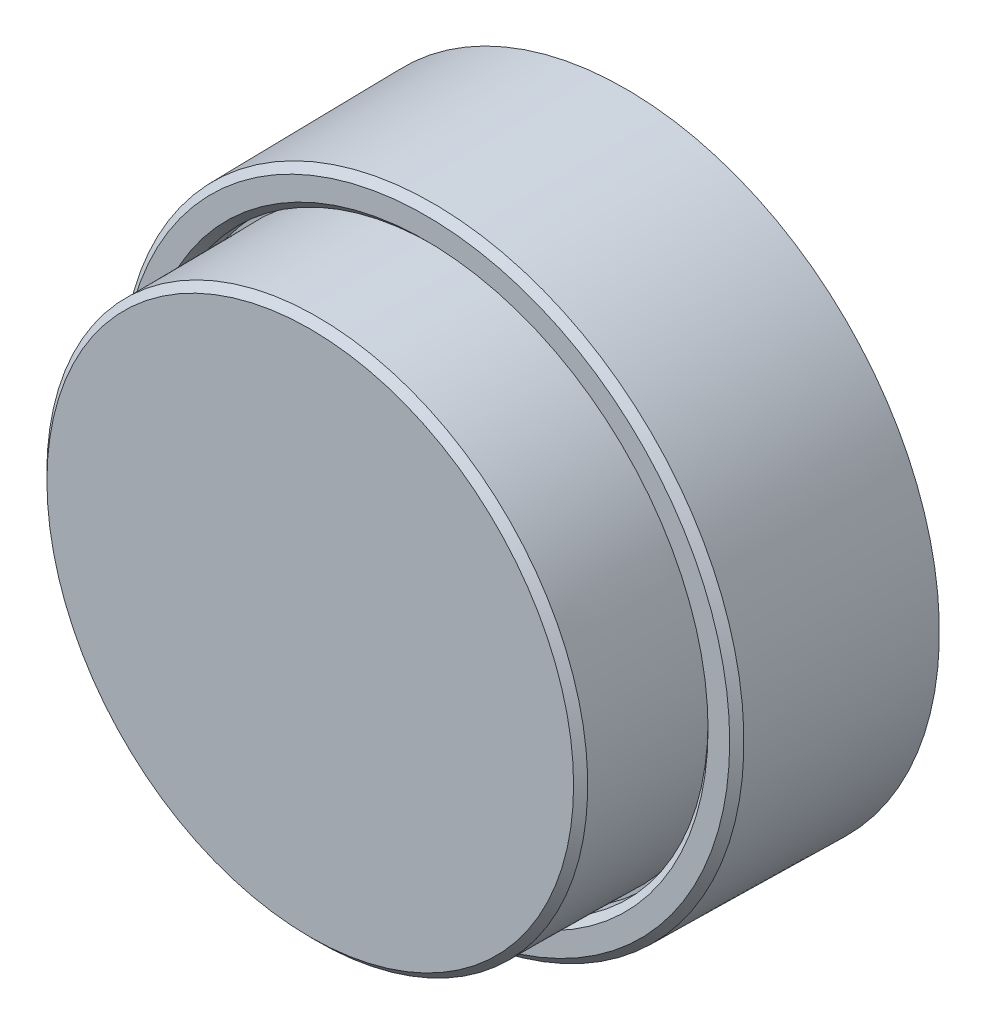
ISO-10303-21;
HEADER;
FILE_DESCRIPTION(('STEP AP214'),'2;1');
FILE_NAME('part.step','',(''),(''),'','','');
FILE_SCHEMA(('AUTOMOTIVE_DESIGN { 1 0 10303 214 1 1 1 1 }'));
ENDSEC;
DATA;
#1=APPLICATION_CONTEXT('core data for automotive mechanical design processes');
#2=APPLICATION_PROTOCOL_DEFINITION('international standard','automotive_design',2000,#1);
#3=PRODUCT_CONTEXT('',#1,'mechanical');
#4=PRODUCT('Part','Part','',(#3));
#5=PRODUCT_RELATED_PRODUCT_CATEGORY('part','',(#4));
#6=PRODUCT_DEFINITION_FORMATION('','',#4);
#7=PRODUCT_DEFINITION_CONTEXT('part definition',#1,'design');
#8=PRODUCT_DEFINITION('design','',#6,#7);
#9=PRODUCT_DEFINITION_SHAPE('','',#8);
#10=(LENGTH_UNIT() NAMED_UNIT(*) SI_UNIT(.MILLI.,.METRE.));
#11=(NAMED_UNIT(*) PLANE_ANGLE_UNIT() SI_UNIT($,.RADIAN.));
#12=(NAMED_UNIT(*) SI_UNIT($,.STERADIAN.) SOLID_ANGLE_UNIT());
#13=UNCERTAINTY_MEASURE_WITH_UNIT(LENGTH_MEASURE(1.E-05),#10,'distance_accuracy_value','');
#14=(GEOMETRIC_REPRESENTATION_CONTEXT(3) GLOBAL_UNCERTAINTY_ASSIGNED_CONTEXT((#13)) GLOBAL_UNIT_ASSIGNED_CONTEXT((#10,
#11,#12)) REPRESENTATION_CONTEXT('',''));
#15=CARTESIAN_POINT('',(0.,0.,0.));
#16=DIRECTION('',(0.,0.,1.));
#17=DIRECTION('',(1.,0.,0.));
#18=AXIS2_PLACEMENT_3D('',#15,#16,#17);
#19=CARTESIAN_POINT('',(-7.603483996,-7.603483996,9.6));
#20=DIRECTION('',(0.,0.,1.));
#21=DIRECTION('',(1.,0.,0.));
#22=AXIS2_PLACEMENT_3D('',#19,#20,#21);
#23=PLANE('',#22);
#24=CARTESIAN_POINT('',(0.,0.,9.6));
#25=DIRECTION('',(0.,0.,-1.));
#26=DIRECTION('',(-1.,0.,0.));
#27=AXIS2_PLACEMENT_3D('',#24,#25,#26);
#28=CIRCLE('',#27,7.513324107);
#29=CARTESIAN_POINT('',(-7.513324107,0.,9.6));
#30=VERTEX_POINT('',#29);
#31=EDGE_CURVE('E17',#30,#30,#28,.T.);
#32=ORIENTED_EDGE('',*,*,#31,.F.);
#33=EDGE_LOOP('',(#32));
#34=FACE_BOUND('',#33,.T.);
#35=ADVANCED_FACE('F14',(#34),#23,.T.);
#36=CARTESIAN_POINT('',(0.,0.,9.40000761500004));
#37=DIRECTION('',(0.,0.,-1.));
#38=DIRECTION('',(-1.,0.,0.));
#39=AXIS2_PLACEMENT_3D('',#36,#37,#38);
#40=CONICAL_SURFACE('',#39,7.71683783599996,0.79412480839449);
#41=ORIENTED_EDGE('',*,*,#31,.T.);
#42=EDGE_LOOP('',(#41));
#43=FACE_BOUND('',#42,.T.);
#44=CARTESIAN_POINT('',(0.,0.,9.40000761500004));
#45=DIRECTION('',(0.,0.,-1.));
#46=DIRECTION('',(-1.,0.,0.));
#47=AXIS2_PLACEMENT_3D('',#44,#45,#46);
#48=CIRCLE('',#47,7.716837836);
#49=CARTESIAN_POINT('',(-7.716837836,0.,9.40000761500009));
#50=VERTEX_POINT('',#49);
#51=EDGE_CURVE('E30',#50,#50,#48,.T.);
#52=ORIENTED_EDGE('',*,*,#51,.F.);
#53=EDGE_LOOP('',(#52));
#54=FACE_BOUND('',#53,.T.);
#55=ADVANCED_FACE('F50',(#43,#54),#40,.T.);
#56=CARTESIAN_POINT('',(0.,0.,5.6000000000001));
#57=DIRECTION('',(0.,0.,-1.));
#58=DIRECTION('',(-1.,0.,0.));
#59=AXIS2_PLACEMENT_3D('',#56,#57,#58);
#60=CONICAL_SURFACE('',#59,7.75,0.00872664624418851);
#61=ORIENTED_EDGE('',*,*,#51,.T.);
#62=EDGE_LOOP('',(#61));
#63=FACE_BOUND('',#62,.T.);
#64=CARTESIAN_POINT('',(0.,0.,5.60000000000005));
#65=DIRECTION('',(0.,0.,-1.));
#66=DIRECTION('',(-1.,0.,0.));
#67=AXIS2_PLACEMENT_3D('',#64,#65,#66);
#68=CIRCLE('',#67,7.75);
#69=CARTESIAN_POINT('',(-7.75,0.,5.60000000000005));
#70=VERTEX_POINT('',#69);
#71=EDGE_CURVE('E40',#70,#70,#68,.T.);
#72=ORIENTED_EDGE('',*,*,#71,.F.);
#73=EDGE_LOOP('',(#72));
#74=FACE_BOUND('',#73,.T.);
#75=ADVANCED_FACE('F60',(#63,#74),#60,.T.);
#76=CARTESIAN_POINT('',(-7.9442,-7.9442,5.6));
#77=DIRECTION('',(0.,0.,1.));
#78=DIRECTION('',(1.,0.,0.));
#79=AXIS2_PLACEMENT_3D('',#76,#77,#78);
#80=PLANE('',#79);
#81=CARTESIAN_POINT('',(0.,0.,5.6));
#82=DIRECTION('',(0.,0.,1.));
#83=DIRECTION('',(1.,0.,0.));
#84=AXIS2_PLACEMENT_3D('',#81,#82,#83);
#85=CIRCLE('',#84,7.85);
#86=CARTESIAN_POINT('',(7.85,0.,5.6));
#87=VERTEX_POINT('',#86);
#88=EDGE_CURVE('E38',#87,#87,#85,.T.);
#89=ORIENTED_EDGE('',*,*,#88,.T.);
#90=EDGE_LOOP('',(#89));
#91=FACE_BOUND('',#90,.T.);
#92=ORIENTED_EDGE('',*,*,#71,.T.);
#93=EDGE_LOOP('',(#92));
#94=FACE_BOUND('',#93,.T.);
#95=ADVANCED_FACE('F87',(#91,#94),#80,.T.);
#96=CARTESIAN_POINT('',(0.,0.,5.6));
#97=DIRECTION('',(0.,0.,1.));
#98=DIRECTION('',(1.,0.,0.));
#99=AXIS2_PLACEMENT_3D('',#96,#97,#98);
#100=CYLINDRICAL_SURFACE('',#99,7.85);
#101=ORIENTED_EDGE('',*,*,#88,.F.);
#102=EDGE_LOOP('',(#101));
#103=FACE_BOUND('',#102,.T.);
#104=CARTESIAN_POINT('',(0.,0.,6.1));
#105=DIRECTION('',(0.,0.,1.));
#106=DIRECTION('',(1.,0.,0.));
#107=AXIS2_PLACEMENT_3D('',#104,#105,#106);
#108=CIRCLE('',#107,7.85);
#109=CARTESIAN_POINT('',(7.85,0.,6.1));
#110=VERTEX_POINT('',#109);
#111=EDGE_CURVE('E37',#110,#110,#108,.T.);
#112=ORIENTED_EDGE('',*,*,#111,.T.);
#113=EDGE_LOOP('',(#112));
#114=FACE_BOUND('',#113,.T.);
#115=ADVANCED_FACE('F83',(#103,#114),#100,.F.);
#116=CARTESIAN_POINT('',(0.,0.,6.29999999999997));
#117=DIRECTION('',(0.,0.,1.));
#118=DIRECTION('',(1.,0.,0.));
#119=AXIS2_PLACEMENT_3D('',#116,#117,#118);
#120=CONICAL_SURFACE('',#119,8.04999999999997,0.785398163397453);
#121=ORIENTED_EDGE('',*,*,#111,.F.);
#122=EDGE_LOOP('',(#121));
#123=FACE_BOUND('',#122,.T.);
#124=CARTESIAN_POINT('',(0.,0.,6.29999999999997));
#125=DIRECTION('',(0.,0.,1.));
#126=DIRECTION('',(1.,0.,0.));
#127=AXIS2_PLACEMENT_3D('',#124,#125,#126);
#128=CIRCLE('',#127,8.04999999999997);
#129=CARTESIAN_POINT('',(8.04999999999997,0.,6.29999999999997));
#130=VERTEX_POINT('',#129);
#131=EDGE_CURVE('E34',#130,#130,#128,.F.);
#132=ORIENTED_EDGE('',*,*,#131,.F.);
#133=EDGE_LOOP('',(#132));
#134=FACE_BOUND('',#133,.T.);
#135=ADVANCED_FACE('F79',(#123,#134),#120,.F.);
#136=CARTESIAN_POINT('',(-8.771566453,-8.771566453,6.3));
#137=DIRECTION('',(0.,0.,1.));
#138=DIRECTION('',(1.,0.,0.));
#139=AXIS2_PLACEMENT_3D('',#136,#137,#138);
#140=PLANE('',#139);
#141=CARTESIAN_POINT('',(0.,0.,6.29999999999997));
#142=DIRECTION('',(0.,0.,-1.));
#143=DIRECTION('',(-1.,0.,0.));
#144=AXIS2_PLACEMENT_3D('',#141,#142,#143);
#145=CIRCLE('',#144,8.66755578400003);
#146=CARTESIAN_POINT('',(-8.66755578400003,0.,6.29999999999997));
#147=VERTEX_POINT('',#146);
#148=EDGE_CURVE('E26',#147,#147,#145,.T.);
#149=ORIENTED_EDGE('',*,*,#148,.F.);
#150=EDGE_LOOP('',(#149));
#151=FACE_BOUND('',#150,.T.);
#152=ORIENTED_EDGE('',*,*,#131,.T.);
#153=EDGE_LOOP('',(#152));
#154=FACE_BOUND('',#153,.T.);
#155=ADVANCED_FACE('F75',(#151,#154),#140,.T.);
#156=CARTESIAN_POINT('',(0.,0.,6.10001949500005));
#157=DIRECTION('',(0.,0.,-1.));
#158=DIRECTION('',(-1.,0.,0.));
#159=AXIS2_PLACEMENT_3D('',#156,#157,#158);
#160=CONICAL_SURFACE('',#159,8.87320024999995,0.799360797178314);
#161=CARTESIAN_POINT('',(0.,0.,6.10001949500005));
#162=DIRECTION('',(0.,0.,-1.));
#163=DIRECTION('',(-1.,0.,0.));
#164=AXIS2_PLACEMENT_3D('',#161,#162,#163);
#165=CIRCLE('',#164,8.87320025000001);
#166=CARTESIAN_POINT('',(-8.87320025000001,0.,6.100019495));
#167=VERTEX_POINT('',#166);
#168=EDGE_CURVE('E21',#167,#167,#165,.T.);
#169=ORIENTED_EDGE('',*,*,#168,.F.);
#170=EDGE_LOOP('',(#169));
#171=FACE_BOUND('',#170,.T.);
#172=ORIENTED_EDGE('',*,*,#148,.T.);
#173=EDGE_LOOP('',(#172));
#174=FACE_BOUND('',#173,.T.);
#175=ADVANCED_FACE('F70',(#171,#174),#160,.T.);
#176=CARTESIAN_POINT('',(0.,0.,0.600000000000076));
#177=DIRECTION('',(0.,0.,-1.));
#178=DIRECTION('',(-1.,0.,0.));
#179=AXIS2_PLACEMENT_3D('',#176,#177,#178);
#180=CONICAL_SURFACE('',#179,8.95,0.013962633981463);
#181=CARTESIAN_POINT('',(0.,0.,0.600000000000045));
#182=DIRECTION('',(0.,0.,-1.));
#183=DIRECTION('',(-1.,0.,0.));
#184=AXIS2_PLACEMENT_3D('',#181,#182,#183);
#185=CIRCLE('',#184,8.95);
#186=CARTESIAN_POINT('',(-8.95,0.,0.600000000000045));
#187=VERTEX_POINT('',#186);
#188=EDGE_CURVE('E10',#187,#187,#185,.F.);
#189=ORIENTED_EDGE('',*,*,#188,.T.);
#190=EDGE_LOOP('',(#189));
#191=FACE_BOUND('',#190,.T.);
#192=ORIENTED_EDGE('',*,*,#168,.T.);
#193=EDGE_LOOP('',(#192));
#194=FACE_BOUND('',#193,.T.);
#195=ADVANCED_FACE('F63',(#191,#194),#180,.T.);
#196=CARTESIAN_POINT('',(-9.0574,-9.0574,0.6));
#197=DIRECTION('',(0.,0.,1.));
#198=DIRECTION('',(1.,0.,0.));
#199=AXIS2_PLACEMENT_3D('',#196,#197,#198);
#200=PLANE('',#199);
#201=ORIENTED_EDGE('',*,*,#188,.F.);
#202=EDGE_LOOP('',(#201));
#203=FACE_BOUND('',#202,.T.);
#204=ADVANCED_FACE('F61',(#203),#200,.F.);
#205=CLOSED_SHELL('',(#35,#55,#75,#95,#115,#135,#155,#175,#195,#204));
#206=MANIFOLD_SOLID_BREP('B1',#205);
#207=ADVANCED_BREP_SHAPE_REPRESENTATION('',(#18,#206),#14);
#208=SHAPE_DEFINITION_REPRESENTATION(#9,#207);
ENDSEC;
END-ISO-10303-21;
